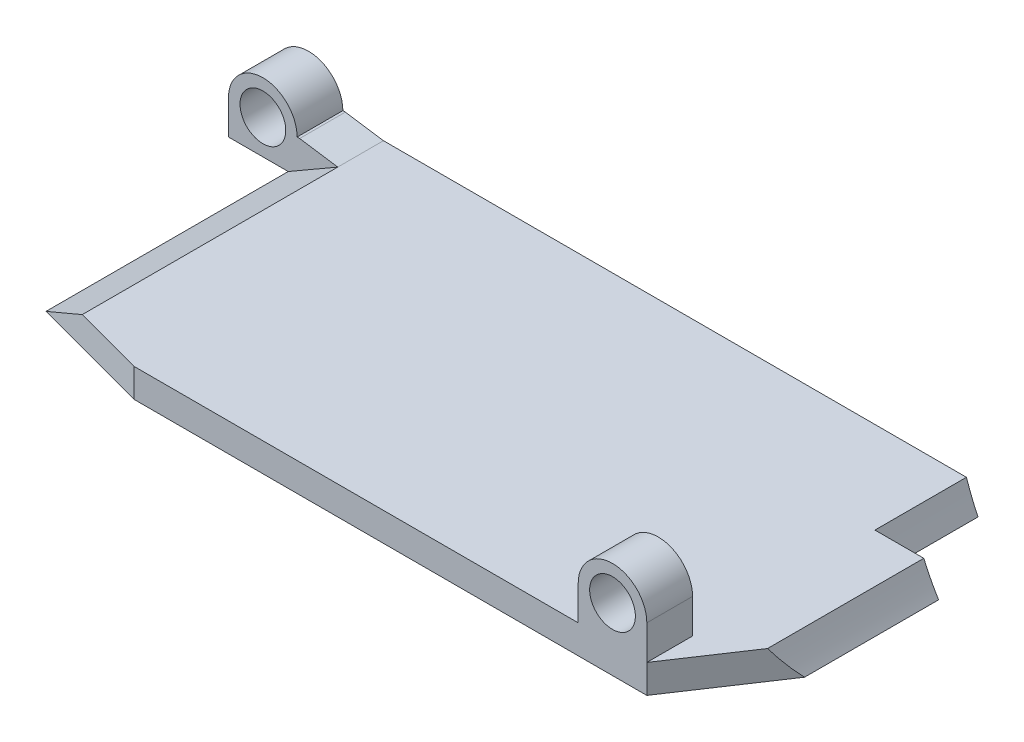
ISO-10303-21;
HEADER;
FILE_DESCRIPTION(('STEP AP214'),'2;1');
FILE_NAME('part.step','',(''),(''),'','','');
FILE_SCHEMA(('AUTOMOTIVE_DESIGN { 1 0 10303 214 1 1 1 1 }'));
ENDSEC;
DATA;
#1=APPLICATION_CONTEXT('core data for automotive mechanical design processes');
#2=APPLICATION_PROTOCOL_DEFINITION('international standard','automotive_design',2000,#1);
#3=PRODUCT_CONTEXT('',#1,'mechanical');
#4=PRODUCT('Part','Part','',(#3));
#5=PRODUCT_RELATED_PRODUCT_CATEGORY('part','',(#4));
#6=PRODUCT_DEFINITION_FORMATION('','',#4);
#7=PRODUCT_DEFINITION_CONTEXT('part definition',#1,'design');
#8=PRODUCT_DEFINITION('design','',#6,#7);
#9=PRODUCT_DEFINITION_SHAPE('','',#8);
#10=(LENGTH_UNIT() NAMED_UNIT(*) SI_UNIT(.MILLI.,.METRE.));
#11=(NAMED_UNIT(*) PLANE_ANGLE_UNIT() SI_UNIT($,.RADIAN.));
#12=(NAMED_UNIT(*) SI_UNIT($,.STERADIAN.) SOLID_ANGLE_UNIT());
#13=UNCERTAINTY_MEASURE_WITH_UNIT(LENGTH_MEASURE(1.E-05),#10,'distance_accuracy_value','');
#14=(GEOMETRIC_REPRESENTATION_CONTEXT(3) GLOBAL_UNCERTAINTY_ASSIGNED_CONTEXT((#13)) GLOBAL_UNIT_ASSIGNED_CONTEXT((#10,
#11,#12)) REPRESENTATION_CONTEXT('',''));
#15=CARTESIAN_POINT('',(0.,0.,0.));
#16=DIRECTION('',(0.,0.,1.));
#17=DIRECTION('',(1.,0.,0.));
#18=AXIS2_PLACEMENT_3D('',#15,#16,#17);
#19=CARTESIAN_POINT('',(-14.6132968385494,25.3109725904531,-16.));
#20=DIRECTION('',(0.500000000000001,-0.866025403784438,0.));
#21=DIRECTION('',(0.866025403784438,0.500000000000001,0.));
#22=AXIS2_PLACEMENT_3D('',#19,#20,#21);
#23=PLANE('',#22);
#24=DIRECTION('',(0.866025403784438,0.500000000000001,0.));
#25=VECTOR('',#24,1.);
#26=CARTESIAN_POINT('',(-14.6132968385494,25.3109725904531,-14.));
#27=LINE('',#26,#25);
#28=CARTESIAN_POINT('',(-15.5849298668677,24.75,-14.));
#29=VERTEX_POINT('',#28);
#30=CARTESIAN_POINT('',(-13.4198663574066,26.,-14.));
#31=VERTEX_POINT('',#30);
#32=EDGE_CURVE('E200',#29,#31,#27,.T.);
#33=ORIENTED_EDGE('',*,*,#32,.F.);
#34=DIRECTION('',(0.,0.,1.));
#35=VECTOR('',#34,1.);
#36=CARTESIAN_POINT('',(-15.5849298668677,24.75,-16.));
#37=LINE('',#36,#35);
#38=CARTESIAN_POINT('',(-15.5849298668677,24.75,-3.40823238021835));
#39=VERTEX_POINT('',#38);
#40=EDGE_CURVE('E274',#29,#39,#37,.T.);
#41=ORIENTED_EDGE('',*,*,#40,.T.);
#42=DIRECTION('',(0.843610022961952,0.48705847384815,0.22604462437945));
#43=VECTOR('',#42,1.);
#44=CARTESIAN_POINT('',(-17.0641119412203,23.8959938311921,-3.80457802249971));
#45=LINE('',#44,#43);
#46=CARTESIAN_POINT('',(-13.4198663574066,26.,-2.82810536129617));
#47=VERTEX_POINT('',#46);
#48=EDGE_CURVE('E230',#39,#47,#45,.T.);
#49=ORIENTED_EDGE('',*,*,#48,.T.);
#50=DIRECTION('',(0.,0.,1.));
#51=VECTOR('',#50,1.);
#52=CARTESIAN_POINT('',(-13.4198663574066,26.,-16.));
#53=LINE('',#52,#51);
#54=EDGE_CURVE('E271',#31,#47,#53,.T.);
#55=ORIENTED_EDGE('',*,*,#54,.F.);
#56=EDGE_LOOP('',(#33,#41,#49,#55));
#57=FACE_BOUND('',#56,.T.);
#58=ADVANCED_FACE('F34',(#57),#23,.F.);
#59=CARTESIAN_POINT('',(22.5,29.5,-16.));
#60=DIRECTION('',(0.,0.,1.));
#61=DIRECTION('',(1.,0.,0.));
#62=AXIS2_PLACEMENT_3D('',#59,#60,#61);
#63=CYLINDRICAL_SURFACE('',#62,9.00000000000001);
#64=CARTESIAN_POINT('',(22.5,29.5,-17.605551275464));
#65=DIRECTION('',(-0.832050294337844,0.,-0.554700196225229));
#66=DIRECTION('',(-0.554700196225229,0.,0.832050294337844));
#67=AXIS2_PLACEMENT_3D('',#64,#65,#66);
#68=ELLIPSE('',#67,16.224980739588,9.00000000000001);
#69=CARTESIAN_POINT('',(14.8555575742897,24.75,-6.1388876368985));
#70=VERTEX_POINT('',#69);
#71=CARTESIAN_POINT('',(14.2084380241115,26.,-5.16820831163123));
#72=VERTEX_POINT('',#71);
#73=EDGE_CURVE('E241',#70,#72,#68,.T.);
#74=ORIENTED_EDGE('',*,*,#73,.F.);
#75=DIRECTION('',(0.,0.,1.));
#76=VECTOR('',#75,1.);
#77=CARTESIAN_POINT('',(14.8555575742897,24.75,-16.));
#78=LINE('',#77,#76);
#79=CARTESIAN_POINT('',(14.8555575742897,24.75,-12.));
#80=VERTEX_POINT('',#79);
#81=EDGE_CURVE('E42',#80,#70,#78,.T.);
#82=ORIENTED_EDGE('',*,*,#81,.F.);
#83=CARTESIAN_POINT('',(22.5,29.5,-12.));
#84=DIRECTION('',(0.,0.,-1.));
#85=DIRECTION('',(-1.,0.,0.));
#86=AXIS2_PLACEMENT_3D('',#83,#84,#85);
#87=CIRCLE('',#86,9.00000000000001);
#88=CARTESIAN_POINT('',(14.2084380241115,26.,-12.));
#89=VERTEX_POINT('',#88);
#90=EDGE_CURVE('E255',#80,#89,#87,.T.);
#91=ORIENTED_EDGE('',*,*,#90,.T.);
#92=DIRECTION('',(0.,0.,1.));
#93=VECTOR('',#92,1.);
#94=CARTESIAN_POINT('',(14.2084380241115,26.,-16.));
#95=LINE('',#94,#93);
#96=EDGE_CURVE('E266',#89,#72,#95,.T.);
#97=ORIENTED_EDGE('',*,*,#96,.T.);
#98=EDGE_LOOP('',(#74,#82,#91,#97));
#99=FACE_BOUND('',#98,.T.);
#100=ADVANCED_FACE('F36',(#99),#63,.F.);
#101=CARTESIAN_POINT('',(0.,24.75,-16.));
#102=DIRECTION('',(0.,-1.,0.));
#103=DIRECTION('',(1.,0.,0.));
#104=AXIS2_PLACEMENT_3D('',#101,#102,#103);
#105=PLANE('',#104);
#106=DIRECTION('',(0.96592582628907,0.,0.258819045102514));
#107=VECTOR('',#106,1.);
#108=CARTESIAN_POINT('',(-10.329335075029,24.75,-2.));
#109=LINE('',#108,#107);
#110=CARTESIAN_POINT('',(-10.329335075029,24.75,-2.));
#111=VERTEX_POINT('',#110);
#112=EDGE_CURVE('E216',#39,#111,#109,.T.);
#113=ORIENTED_EDGE('',*,*,#112,.F.);
#114=ORIENTED_EDGE('',*,*,#40,.F.);
#115=DIRECTION('',(-1.,0.,0.));
#116=VECTOR('',#115,1.);
#117=CARTESIAN_POINT('',(0.,24.75,-14.));
#118=LINE('',#117,#116);
#119=CARTESIAN_POINT('',(-18.1957444455323,24.75,-14.));
#120=VERTEX_POINT('',#119);
#121=EDGE_CURVE('E184',#29,#120,#118,.T.);
#122=ORIENTED_EDGE('',*,*,#121,.T.);
#123=DIRECTION('',(0.,0.,-1.));
#124=VECTOR('',#123,1.);
#125=CARTESIAN_POINT('',(-18.1957444455323,24.75,-14.));
#126=LINE('',#125,#124);
#127=CARTESIAN_POINT('',(-18.1957444455323,24.75,-16.));
#128=VERTEX_POINT('',#127);
#129=EDGE_CURVE('E203',#120,#128,#126,.T.);
#130=ORIENTED_EDGE('',*,*,#129,.T.);
#131=DIRECTION('',(1.,0.,0.));
#132=VECTOR('',#131,1.);
#133=CARTESIAN_POINT('',(0.,24.75,-16.));
#134=LINE('',#133,#132);
#135=CARTESIAN_POINT('',(12.5784325835078,24.75,-16.));
#136=VERTEX_POINT('',#135);
#137=EDGE_CURVE('E259',#128,#136,#134,.T.);
#138=ORIENTED_EDGE('',*,*,#137,.T.);
#139=DIRECTION('',(0.,0.,-1.));
#140=VECTOR('',#139,1.);
#141=CARTESIAN_POINT('',(12.5784325835078,24.75,-12.));
#142=LINE('',#141,#140);
#143=CARTESIAN_POINT('',(12.5784325835078,24.75,-12.));
#144=VERTEX_POINT('',#143);
#145=EDGE_CURVE('E249',#144,#136,#142,.T.);
#146=ORIENTED_EDGE('',*,*,#145,.F.);
#147=DIRECTION('',(-1.,0.,0.));
#148=VECTOR('',#147,1.);
#149=CARTESIAN_POINT('',(12.5784325835078,24.75,-12.));
#150=LINE('',#149,#148);
#151=EDGE_CURVE('E247',#80,#144,#150,.T.);
#152=ORIENTED_EDGE('',*,*,#151,.F.);
#153=ORIENTED_EDGE('',*,*,#81,.T.);
#154=DIRECTION('',(0.554700196225229,0.,-0.832050294337844));
#155=VECTOR('',#154,1.);
#156=CARTESIAN_POINT('',(12.0962991496907,24.75,-2.));
#157=LINE('',#156,#155);
#158=CARTESIAN_POINT('',(12.0962991496907,24.75,-2.));
#159=VERTEX_POINT('',#158);
#160=EDGE_CURVE('E233',#159,#70,#157,.T.);
#161=ORIENTED_EDGE('',*,*,#160,.F.);
#162=DIRECTION('',(1.,0.,0.));
#163=VECTOR('',#162,1.);
#164=CARTESIAN_POINT('',(0.,24.75,-2.));
#165=LINE('',#164,#163);
#166=EDGE_CURVE('E258',#111,#159,#165,.T.);
#167=ORIENTED_EDGE('',*,*,#166,.F.);
#168=EDGE_LOOP('',(#113,#114,#122,#130,#138,#146,#152,#153,#161,#167));
#169=FACE_BOUND('',#168,.T.);
#170=ADVANCED_FACE('F281',(#169),#105,.T.);
#171=CARTESIAN_POINT('',(0.,26.,-16.));
#172=DIRECTION('',(0.,-1.,0.));
#173=DIRECTION('',(0.,0.,-1.));
#174=AXIS2_PLACEMENT_3D('',#171,#172,#173);
#175=PLANE('',#174);
#176=DIRECTION('',(-1.,0.,0.));
#177=VECTOR('',#176,1.);
#178=CARTESIAN_POINT('',(0.,26.,-4.));
#179=LINE('',#178,#177);
#180=CARTESIAN_POINT('',(12.0962991496907,26.,-4.));
#181=VERTEX_POINT('',#180);
#182=CARTESIAN_POINT('',(9.09629914969067,26.,-4.));
#183=VERTEX_POINT('',#182);
#184=EDGE_CURVE('E53',#181,#183,#179,.T.);
#185=ORIENTED_EDGE('',*,*,#184,.F.);
#186=DIRECTION('',(0.,0.,1.));
#187=VECTOR('',#186,1.);
#188=CARTESIAN_POINT('',(12.0962991496907,26.,-4.));
#189=LINE('',#188,#187);
#190=CARTESIAN_POINT('',(12.0962991496907,26.,-2.));
#191=VERTEX_POINT('',#190);
#192=EDGE_CURVE('E166',#181,#191,#189,.T.);
#193=ORIENTED_EDGE('',*,*,#192,.T.);
#194=DIRECTION('',(0.554700196225229,0.,-0.832050294337844));
#195=VECTOR('',#194,1.);
#196=CARTESIAN_POINT('',(12.0962991496907,26.,-2.));
#197=LINE('',#196,#195);
#198=EDGE_CURVE('E234',#191,#72,#197,.T.);
#199=ORIENTED_EDGE('',*,*,#198,.T.);
#200=ORIENTED_EDGE('',*,*,#96,.F.);
#201=DIRECTION('',(1.,0.,0.));
#202=VECTOR('',#201,1.);
#203=CARTESIAN_POINT('',(0.,26.,-12.));
#204=LINE('',#203,#202);
#205=CARTESIAN_POINT('',(12.0716731926929,26.,-12.));
#206=VERTEX_POINT('',#205);
#207=EDGE_CURVE('E11',#206,#89,#204,.T.);
#208=ORIENTED_EDGE('',*,*,#207,.F.);
#209=DIRECTION('',(0.,0.,-1.));
#210=VECTOR('',#209,1.);
#211=CARTESIAN_POINT('',(12.0716731926929,26.,-12.));
#212=LINE('',#211,#210);
#213=CARTESIAN_POINT('',(12.0716731926929,26.,-16.));
#214=VERTEX_POINT('',#213);
#215=EDGE_CURVE('E252',#206,#214,#212,.T.);
#216=ORIENTED_EDGE('',*,*,#215,.T.);
#217=DIRECTION('',(1.,0.,0.));
#218=VECTOR('',#217,1.);
#219=CARTESIAN_POINT('',(0.,26.,-16.));
#220=LINE('',#219,#218);
#221=CARTESIAN_POINT('',(-13.4198663574066,26.,-16.));
#222=VERTEX_POINT('',#221);
#223=EDGE_CURVE('E262',#222,#214,#220,.T.);
#224=ORIENTED_EDGE('',*,*,#223,.F.);
#225=EDGE_CURVE('E272',#222,#31,#53,.T.);
#226=ORIENTED_EDGE('',*,*,#225,.T.);
#227=ORIENTED_EDGE('',*,*,#54,.T.);
#228=DIRECTION('',(0.96592582628907,0.,0.258819045102514));
#229=VECTOR('',#228,1.);
#230=CARTESIAN_POINT('',(-10.329335075029,26.,-2.));
#231=LINE('',#230,#229);
#232=CARTESIAN_POINT('',(-10.329335075029,26.,-2.));
#233=VERTEX_POINT('',#232);
#234=EDGE_CURVE('E223',#47,#233,#231,.T.);
#235=ORIENTED_EDGE('',*,*,#234,.T.);
#236=DIRECTION('',(1.,0.,0.));
#237=VECTOR('',#236,1.);
#238=CARTESIAN_POINT('',(0.,26.,-2.));
#239=LINE('',#238,#237);
#240=CARTESIAN_POINT('',(9.09629914969067,26.,-2.));
#241=VERTEX_POINT('',#240);
#242=EDGE_CURVE('E263',#233,#241,#239,.T.);
#243=ORIENTED_EDGE('',*,*,#242,.T.);
#244=DIRECTION('',(0.,0.,1.));
#245=VECTOR('',#244,1.);
#246=CARTESIAN_POINT('',(9.09629914969067,26.,-4.));
#247=LINE('',#246,#245);
#248=EDGE_CURVE('E49',#183,#241,#247,.T.);
#249=ORIENTED_EDGE('',*,*,#248,.F.);
#250=EDGE_LOOP('',(#185,#193,#199,#200,#208,#216,#224,#226,#227,#235,#243,#249));
#251=FACE_BOUND('',#250,.T.);
#252=ADVANCED_FACE('F290',(#251),#175,.F.);
#253=CARTESIAN_POINT('',(0.,0.,-16.));
#254=DIRECTION('',(0.,0.,-1.));
#255=DIRECTION('',(-1.,0.,0.));
#256=AXIS2_PLACEMENT_3D('',#253,#254,#255);
#257=PLANE('',#256);
#258=CARTESIAN_POINT('',(-16.6917910527879,26.25,-16.));
#259=DIRECTION('',(0.,0.,-1.));
#260=DIRECTION('',(-1.,0.,0.));
#261=AXIS2_PLACEMENT_3D('',#258,#259,#260);
#262=CIRCLE('',#261,1.);
#263=CARTESIAN_POINT('',(-17.6917910527879,26.25,-16.));
#264=VERTEX_POINT('',#263);
#265=EDGE_CURVE('E360',#264,#264,#262,.T.);
#266=ORIENTED_EDGE('',*,*,#265,.F.);
#267=EDGE_LOOP('',(#266));
#268=FACE_BOUND('',#267,.T.);
#269=CARTESIAN_POINT('',(22.5,29.5,-16.));
#270=DIRECTION('',(0.,0.,-1.));
#271=DIRECTION('',(-1.,0.,0.));
#272=AXIS2_PLACEMENT_3D('',#269,#270,#271);
#273=CIRCLE('',#272,11.);
#274=EDGE_CURVE('E243',#136,#214,#273,.T.);
#275=ORIENTED_EDGE('',*,*,#274,.F.);
#276=ORIENTED_EDGE('',*,*,#137,.F.);
#277=DIRECTION('',(0.,1.,0.));
#278=VECTOR('',#277,1.);
#279=CARTESIAN_POINT('',(-18.1957444455323,0.,-16.));
#280=LINE('',#279,#278);
#281=CARTESIAN_POINT('',(-18.1957444455323,26.25,-16.));
#282=VERTEX_POINT('',#281);
#283=EDGE_CURVE('E181',#128,#282,#280,.T.);
#284=ORIENTED_EDGE('',*,*,#283,.T.);
#285=CARTESIAN_POINT('',(-16.6957444455323,26.25,-16.));
#286=DIRECTION('',(0.,0.,-1.));
#287=DIRECTION('',(-1.,0.,0.));
#288=AXIS2_PLACEMENT_3D('',#285,#286,#287);
#289=CIRCLE('',#288,1.5);
#290=CARTESIAN_POINT('',(-15.1957444455323,26.25,-16.));
#291=VERTEX_POINT('',#290);
#292=EDGE_CURVE('E206',#282,#291,#289,.T.);
#293=ORIENTED_EDGE('',*,*,#292,.T.);
#294=DIRECTION('',(1.,0.,0.));
#295=VECTOR('',#294,1.);
#296=CARTESIAN_POINT('',(0.,26.25,-16.));
#297=LINE('',#296,#295);
#298=CARTESIAN_POINT('',(-15.0857444455323,26.25,-16.));
#299=VERTEX_POINT('',#298);
#300=EDGE_CURVE('E209',#291,#299,#297,.T.);
#301=ORIENTED_EDGE('',*,*,#300,.T.);
#302=DIRECTION('',(0.988926049356473,-0.148409126755062,0.));
#303=VECTOR('',#302,1.);
#304=CARTESIAN_POINT('',(3.5203307714882,23.4577675807065,-16.));
#305=LINE('',#304,#303);
#306=EDGE_CURVE('E188',#299,#222,#305,.T.);
#307=ORIENTED_EDGE('',*,*,#306,.T.);
#308=ORIENTED_EDGE('',*,*,#223,.T.);
#309=EDGE_LOOP('',(#275,#276,#284,#293,#301,#307,#308));
#310=FACE_BOUND('',#309,.T.);
#311=ADVANCED_FACE('F324',(#268,#310),#257,.T.);
#312=CARTESIAN_POINT('',(0.,0.,-2.));
#313=DIRECTION('',(0.,0.,-1.));
#314=DIRECTION('',(-1.,0.,0.));
#315=AXIS2_PLACEMENT_3D('',#312,#313,#314);
#316=PLANE('',#315);
#317=CARTESIAN_POINT('',(10.5962991496907,27.5,-2.));
#318=DIRECTION('',(0.,0.,1.));
#319=DIRECTION('',(1.,0.,0.));
#320=AXIS2_PLACEMENT_3D('',#317,#318,#319);
#321=CIRCLE('',#320,0.999999999999987);
#322=CARTESIAN_POINT('',(11.5962991496907,27.5,-2.));
#323=VERTEX_POINT('',#322);
#324=EDGE_CURVE('E365',#323,#323,#321,.T.);
#325=ORIENTED_EDGE('',*,*,#324,.F.);
#326=EDGE_LOOP('',(#325));
#327=FACE_BOUND('',#326,.T.);
#328=ORIENTED_EDGE('',*,*,#242,.F.);
#329=DIRECTION('',(0.,-1.,0.));
#330=VECTOR('',#329,1.);
#331=CARTESIAN_POINT('',(-10.329335075029,26.,-2.));
#332=LINE('',#331,#330);
#333=EDGE_CURVE('E226',#233,#111,#332,.T.);
#334=ORIENTED_EDGE('',*,*,#333,.T.);
#335=ORIENTED_EDGE('',*,*,#166,.T.);
#336=DIRECTION('',(0.,-1.,0.));
#337=VECTOR('',#336,1.);
#338=CARTESIAN_POINT('',(12.0962991496907,26.,-2.));
#339=LINE('',#338,#337);
#340=EDGE_CURVE('E237',#191,#159,#339,.T.);
#341=ORIENTED_EDGE('',*,*,#340,.F.);
#342=DIRECTION('',(0.,1.,0.));
#343=VECTOR('',#342,1.);
#344=CARTESIAN_POINT('',(12.0962991496907,0.,-2.));
#345=LINE('',#344,#343);
#346=CARTESIAN_POINT('',(12.0962991496907,27.5,-2.));
#347=VERTEX_POINT('',#346);
#348=EDGE_CURVE('E177',#191,#347,#345,.T.);
#349=ORIENTED_EDGE('',*,*,#348,.T.);
#350=CARTESIAN_POINT('',(10.5962991496907,27.5,-2.));
#351=DIRECTION('',(0.,0.,1.));
#352=DIRECTION('',(1.,0.,0.));
#353=AXIS2_PLACEMENT_3D('',#350,#351,#352);
#354=CIRCLE('',#353,1.5);
#355=CARTESIAN_POINT('',(9.09629914969068,27.5,-2.));
#356=VERTEX_POINT('',#355);
#357=EDGE_CURVE('E150',#347,#356,#354,.T.);
#358=ORIENTED_EDGE('',*,*,#357,.T.);
#359=DIRECTION('',(0.,-1.,0.));
#360=VECTOR('',#359,1.);
#361=CARTESIAN_POINT('',(9.09629914969062,0.,-2.));
#362=LINE('',#361,#360);
#363=EDGE_CURVE('E167',#356,#241,#362,.T.);
#364=ORIENTED_EDGE('',*,*,#363,.T.);
#365=EDGE_LOOP('',(#328,#334,#335,#341,#349,#358,#364));
#366=FACE_BOUND('',#365,.T.);
#367=ADVANCED_FACE('F294',(#327,#366),#316,.F.);
#368=CARTESIAN_POINT('',(22.5,29.5,-12.));
#369=DIRECTION('',(0.,0.,-1.));
#370=DIRECTION('',(-1.,0.,0.));
#371=AXIS2_PLACEMENT_3D('',#368,#369,#370);
#372=CYLINDRICAL_SURFACE('',#371,11.);
#373=CARTESIAN_POINT('',(22.5,29.5,-12.));
#374=DIRECTION('',(0.,0.,-1.));
#375=DIRECTION('',(-1.,0.,0.));
#376=AXIS2_PLACEMENT_3D('',#373,#374,#375);
#377=CIRCLE('',#376,11.);
#378=EDGE_CURVE('E244',#144,#206,#377,.T.);
#379=ORIENTED_EDGE('',*,*,#378,.F.);
#380=ORIENTED_EDGE('',*,*,#145,.T.);
#381=ORIENTED_EDGE('',*,*,#274,.T.);
#382=ORIENTED_EDGE('',*,*,#215,.F.);
#383=EDGE_LOOP('',(#379,#380,#381,#382));
#384=FACE_BOUND('',#383,.T.);
#385=ADVANCED_FACE('F327',(#384),#372,.F.);
#386=CARTESIAN_POINT('',(22.5,29.5,-12.));
#387=DIRECTION('',(0.,0.,-1.));
#388=DIRECTION('',(-1.,0.,0.));
#389=AXIS2_PLACEMENT_3D('',#386,#387,#388);
#390=PLANE('',#389);
#391=ORIENTED_EDGE('',*,*,#151,.T.);
#392=ORIENTED_EDGE('',*,*,#378,.T.);
#393=ORIENTED_EDGE('',*,*,#207,.T.);
#394=ORIENTED_EDGE('',*,*,#90,.F.);
#395=EDGE_LOOP('',(#391,#392,#393,#394));
#396=FACE_BOUND('',#395,.T.);
#397=ADVANCED_FACE('F329',(#396),#390,.T.);
#398=CARTESIAN_POINT('',(12.0962991496907,26.,-2.));
#399=DIRECTION('',(-0.832050294337844,0.,-0.554700196225229));
#400=DIRECTION('',(-0.554700196225229,0.,0.832050294337844));
#401=AXIS2_PLACEMENT_3D('',#398,#399,#400);
#402=PLANE('',#401);
#403=ORIENTED_EDGE('',*,*,#73,.T.);
#404=ORIENTED_EDGE('',*,*,#198,.F.);
#405=ORIENTED_EDGE('',*,*,#340,.T.);
#406=ORIENTED_EDGE('',*,*,#160,.T.);
#407=EDGE_LOOP('',(#403,#404,#405,#406));
#408=FACE_BOUND('',#407,.T.);
#409=ADVANCED_FACE('F289',(#408),#402,.F.);
#410=CARTESIAN_POINT('',(-10.329335075029,26.,-2.));
#411=DIRECTION('',(0.258819045102514,0.,-0.96592582628907));
#412=DIRECTION('',(-0.96592582628907,0.,-0.258819045102514));
#413=AXIS2_PLACEMENT_3D('',#410,#411,#412);
#414=PLANE('',#413);
#415=ORIENTED_EDGE('',*,*,#112,.T.);
#416=ORIENTED_EDGE('',*,*,#333,.F.);
#417=ORIENTED_EDGE('',*,*,#234,.F.);
#418=ORIENTED_EDGE('',*,*,#48,.F.);
#419=EDGE_LOOP('',(#415,#416,#417,#418));
#420=FACE_BOUND('',#419,.T.);
#421=ADVANCED_FACE('F299',(#420),#414,.F.);
#422=CARTESIAN_POINT('',(3.5203307714882,23.4577675807065,-14.));
#423=DIRECTION('',(0.148409126755062,0.988926049356472,0.));
#424=DIRECTION('',(-0.988926049356472,0.148409126755062,0.));
#425=AXIS2_PLACEMENT_3D('',#422,#423,#424);
#426=PLANE('',#425);
#427=ORIENTED_EDGE('',*,*,#306,.F.);
#428=DIRECTION('',(0.,0.,-1.));
#429=VECTOR('',#428,1.);
#430=CARTESIAN_POINT('',(-15.0857444455323,26.25,-14.));
#431=LINE('',#430,#429);
#432=CARTESIAN_POINT('',(-15.0857444455323,26.25,-14.));
#433=VERTEX_POINT('',#432);
#434=EDGE_CURVE('E214',#433,#299,#431,.T.);
#435=ORIENTED_EDGE('',*,*,#434,.F.);
#436=DIRECTION('',(0.988926049356473,-0.148409126755062,0.));
#437=VECTOR('',#436,1.);
#438=CARTESIAN_POINT('',(3.5203307714882,23.4577675807065,-14.));
#439=LINE('',#438,#437);
#440=EDGE_CURVE('E197',#433,#31,#439,.T.);
#441=ORIENTED_EDGE('',*,*,#440,.T.);
#442=ORIENTED_EDGE('',*,*,#225,.F.);
#443=EDGE_LOOP('',(#427,#435,#441,#442));
#444=FACE_BOUND('',#443,.T.);
#445=ADVANCED_FACE('F311',(#444),#426,.T.);
#446=CARTESIAN_POINT('',(0.,26.25,-14.));
#447=DIRECTION('',(0.,1.,0.));
#448=DIRECTION('',(0.,0.,1.));
#449=AXIS2_PLACEMENT_3D('',#446,#447,#448);
#450=PLANE('',#449);
#451=ORIENTED_EDGE('',*,*,#300,.F.);
#452=DIRECTION('',(0.,0.,-1.));
#453=VECTOR('',#452,1.);
#454=CARTESIAN_POINT('',(-15.1957444455323,26.25,-14.));
#455=LINE('',#454,#453);
#456=CARTESIAN_POINT('',(-15.1957444455323,26.25,-14.));
#457=VERTEX_POINT('',#456);
#458=EDGE_CURVE('E217',#457,#291,#455,.T.);
#459=ORIENTED_EDGE('',*,*,#458,.F.);
#460=DIRECTION('',(1.,0.,0.));
#461=VECTOR('',#460,1.);
#462=CARTESIAN_POINT('',(0.,26.25,-14.));
#463=LINE('',#462,#461);
#464=EDGE_CURVE('E194',#457,#433,#463,.T.);
#465=ORIENTED_EDGE('',*,*,#464,.T.);
#466=ORIENTED_EDGE('',*,*,#434,.T.);
#467=EDGE_LOOP('',(#451,#459,#465,#466));
#468=FACE_BOUND('',#467,.T.);
#469=ADVANCED_FACE('F314',(#468),#450,.T.);
#470=CARTESIAN_POINT('',(-16.6957444455323,26.25,-14.));
#471=DIRECTION('',(0.,0.,-1.));
#472=DIRECTION('',(-1.,0.,0.));
#473=AXIS2_PLACEMENT_3D('',#470,#471,#472);
#474=CYLINDRICAL_SURFACE('',#473,1.5);
#475=ORIENTED_EDGE('',*,*,#292,.F.);
#476=DIRECTION('',(0.,0.,-1.));
#477=VECTOR('',#476,1.);
#478=CARTESIAN_POINT('',(-18.1957444455323,26.25,-14.));
#479=LINE('',#478,#477);
#480=CARTESIAN_POINT('',(-18.1957444455323,26.25,-14.));
#481=VERTEX_POINT('',#480);
#482=EDGE_CURVE('E219',#481,#282,#479,.T.);
#483=ORIENTED_EDGE('',*,*,#482,.F.);
#484=CARTESIAN_POINT('',(-16.6957444455323,26.25,-14.));
#485=DIRECTION('',(0.,0.,-1.));
#486=DIRECTION('',(-1.,0.,0.));
#487=AXIS2_PLACEMENT_3D('',#484,#485,#486);
#488=CIRCLE('',#487,1.5);
#489=EDGE_CURVE('E191',#481,#457,#488,.T.);
#490=ORIENTED_EDGE('',*,*,#489,.T.);
#491=ORIENTED_EDGE('',*,*,#458,.T.);
#492=EDGE_LOOP('',(#475,#483,#490,#491));
#493=FACE_BOUND('',#492,.T.);
#494=ADVANCED_FACE('F318',(#493),#474,.T.);
#495=CARTESIAN_POINT('',(-18.1957444455323,0.,-14.));
#496=DIRECTION('',(-1.,0.,0.));
#497=DIRECTION('',(0.,0.,1.));
#498=AXIS2_PLACEMENT_3D('',#495,#496,#497);
#499=PLANE('',#498);
#500=ORIENTED_EDGE('',*,*,#283,.F.);
#501=ORIENTED_EDGE('',*,*,#129,.F.);
#502=DIRECTION('',(0.,1.,0.));
#503=VECTOR('',#502,1.);
#504=CARTESIAN_POINT('',(-18.1957444455323,0.,-14.));
#505=LINE('',#504,#503);
#506=EDGE_CURVE('E187',#120,#481,#505,.T.);
#507=ORIENTED_EDGE('',*,*,#506,.T.);
#508=ORIENTED_EDGE('',*,*,#482,.T.);
#509=EDGE_LOOP('',(#500,#501,#507,#508));
#510=FACE_BOUND('',#509,.T.);
#511=ADVANCED_FACE('F321',(#510),#499,.T.);
#512=CARTESIAN_POINT('',(0.,0.,-14.));
#513=DIRECTION('',(0.,0.,-1.));
#514=DIRECTION('',(-1.,0.,0.));
#515=AXIS2_PLACEMENT_3D('',#512,#513,#514);
#516=PLANE('',#515);
#517=CARTESIAN_POINT('',(-16.6917910527879,26.25,-14.));
#518=DIRECTION('',(0.,0.,-1.));
#519=DIRECTION('',(-1.,0.,0.));
#520=AXIS2_PLACEMENT_3D('',#517,#518,#519);
#521=CIRCLE('',#520,0.999999999999999);
#522=CARTESIAN_POINT('',(-17.6917910527879,26.25,-14.));
#523=VERTEX_POINT('',#522);
#524=EDGE_CURVE('E172',#523,#523,#521,.T.);
#525=ORIENTED_EDGE('',*,*,#524,.T.);
#526=EDGE_LOOP('',(#525));
#527=FACE_BOUND('',#526,.T.);
#528=ORIENTED_EDGE('',*,*,#121,.F.);
#529=ORIENTED_EDGE('',*,*,#32,.T.);
#530=ORIENTED_EDGE('',*,*,#440,.F.);
#531=ORIENTED_EDGE('',*,*,#464,.F.);
#532=ORIENTED_EDGE('',*,*,#489,.F.);
#533=ORIENTED_EDGE('',*,*,#506,.F.);
#534=EDGE_LOOP('',(#528,#529,#530,#531,#532,#533));
#535=FACE_BOUND('',#534,.T.);
#536=ADVANCED_FACE('F305',(#527,#535),#516,.F.);
#537=CARTESIAN_POINT('',(12.0962991496907,0.,-4.));
#538=DIRECTION('',(1.,0.,0.));
#539=DIRECTION('',(0.,0.,-1.));
#540=AXIS2_PLACEMENT_3D('',#537,#538,#539);
#541=PLANE('',#540);
#542=ORIENTED_EDGE('',*,*,#348,.F.);
#543=ORIENTED_EDGE('',*,*,#192,.F.);
#544=DIRECTION('',(0.,1.,0.));
#545=VECTOR('',#544,1.);
#546=CARTESIAN_POINT('',(12.0962991496907,0.,-4.));
#547=LINE('',#546,#545);
#548=CARTESIAN_POINT('',(12.0962991496907,27.5,-4.));
#549=VERTEX_POINT('',#548);
#550=EDGE_CURVE('E161',#181,#549,#547,.T.);
#551=ORIENTED_EDGE('',*,*,#550,.T.);
#552=DIRECTION('',(0.,0.,1.));
#553=VECTOR('',#552,1.);
#554=CARTESIAN_POINT('',(12.0962991496907,27.5,-4.));
#555=LINE('',#554,#553);
#556=EDGE_CURVE('E145',#549,#347,#555,.T.);
#557=ORIENTED_EDGE('',*,*,#556,.T.);
#558=EDGE_LOOP('',(#542,#543,#551,#557));
#559=FACE_BOUND('',#558,.T.);
#560=ADVANCED_FACE('F165',(#559),#541,.T.);
#561=CARTESIAN_POINT('',(9.09629914969062,0.,-4.));
#562=DIRECTION('',(-1.,0.,0.));
#563=DIRECTION('',(0.,-1.,0.));
#564=AXIS2_PLACEMENT_3D('',#561,#562,#563);
#565=PLANE('',#564);
#566=ORIENTED_EDGE('',*,*,#363,.F.);
#567=DIRECTION('',(0.,0.,1.));
#568=VECTOR('',#567,1.);
#569=CARTESIAN_POINT('',(9.09629914969068,27.5,-4.));
#570=LINE('',#569,#568);
#571=CARTESIAN_POINT('',(9.09629914969068,27.5,-4.));
#572=VERTEX_POINT('',#571);
#573=EDGE_CURVE('E155',#572,#356,#570,.T.);
#574=ORIENTED_EDGE('',*,*,#573,.F.);
#575=DIRECTION('',(0.,-1.,0.));
#576=VECTOR('',#575,1.);
#577=CARTESIAN_POINT('',(9.09629914969062,0.,-4.));
#578=LINE('',#577,#576);
#579=EDGE_CURVE('E163',#572,#183,#578,.T.);
#580=ORIENTED_EDGE('',*,*,#579,.T.);
#581=ORIENTED_EDGE('',*,*,#248,.T.);
#582=EDGE_LOOP('',(#566,#574,#580,#581));
#583=FACE_BOUND('',#582,.T.);
#584=ADVANCED_FACE('F385',(#583),#565,.T.);
#585=CARTESIAN_POINT('',(10.5962991496907,27.5,-4.));
#586=DIRECTION('',(0.,0.,1.));
#587=DIRECTION('',(1.,0.,0.));
#588=AXIS2_PLACEMENT_3D('',#585,#586,#587);
#589=CYLINDRICAL_SURFACE('',#588,1.5);
#590=ORIENTED_EDGE('',*,*,#357,.F.);
#591=ORIENTED_EDGE('',*,*,#556,.F.);
#592=CARTESIAN_POINT('',(10.5962991496907,27.5,-4.));
#593=DIRECTION('',(0.,0.,1.));
#594=DIRECTION('',(1.,0.,0.));
#595=AXIS2_PLACEMENT_3D('',#592,#593,#594);
#596=CIRCLE('',#595,1.5);
#597=EDGE_CURVE('E148',#549,#572,#596,.T.);
#598=ORIENTED_EDGE('',*,*,#597,.T.);
#599=ORIENTED_EDGE('',*,*,#573,.T.);
#600=EDGE_LOOP('',(#590,#591,#598,#599));
#601=FACE_BOUND('',#600,.T.);
#602=ADVANCED_FACE('F147',(#601),#589,.T.);
#603=CARTESIAN_POINT('',(0.,0.,-4.));
#604=DIRECTION('',(0.,0.,1.));
#605=DIRECTION('',(1.,0.,0.));
#606=AXIS2_PLACEMENT_3D('',#603,#604,#605);
#607=PLANE('',#606);
#608=CARTESIAN_POINT('',(10.5962991496907,27.5,-4.));
#609=DIRECTION('',(0.,0.,1.));
#610=DIRECTION('',(1.,0.,0.));
#611=AXIS2_PLACEMENT_3D('',#608,#609,#610);
#612=CIRCLE('',#611,0.999999999999993);
#613=CARTESIAN_POINT('',(11.5962991496907,27.5,-4.));
#614=VERTEX_POINT('',#613);
#615=EDGE_CURVE('E362',#614,#614,#612,.T.);
#616=ORIENTED_EDGE('',*,*,#615,.T.);
#617=EDGE_LOOP('',(#616));
#618=FACE_BOUND('',#617,.T.);
#619=ORIENTED_EDGE('',*,*,#550,.F.);
#620=ORIENTED_EDGE('',*,*,#184,.T.);
#621=ORIENTED_EDGE('',*,*,#579,.F.);
#622=ORIENTED_EDGE('',*,*,#597,.F.);
#623=EDGE_LOOP('',(#619,#620,#621,#622));
#624=FACE_BOUND('',#623,.T.);
#625=ADVANCED_FACE('F160',(#618,#624),#607,.F.);
#626=CARTESIAN_POINT('',(-16.6917910527879,26.25,-16.));
#627=DIRECTION('',(0.,0.,-1.));
#628=DIRECTION('',(-1.,0.,0.));
#629=AXIS2_PLACEMENT_3D('',#626,#627,#628);
#630=CYLINDRICAL_SURFACE('',#629,0.999999999999999);
#631=ORIENTED_EDGE('',*,*,#265,.T.);
#632=EDGE_LOOP('',(#631));
#633=FACE_BOUND('',#632,.T.);
#634=ORIENTED_EDGE('',*,*,#524,.F.);
#635=EDGE_LOOP('',(#634));
#636=FACE_BOUND('',#635,.T.);
#637=ADVANCED_FACE('F374',(#633,#636),#630,.F.);
#638=CARTESIAN_POINT('',(10.5962991496907,27.5,-2.));
#639=DIRECTION('',(0.,0.,1.));
#640=DIRECTION('',(1.,0.,0.));
#641=AXIS2_PLACEMENT_3D('',#638,#639,#640);
#642=CYLINDRICAL_SURFACE('',#641,0.999999999999993);
#643=ORIENTED_EDGE('',*,*,#324,.T.);
#644=EDGE_LOOP('',(#643));
#645=FACE_BOUND('',#644,.T.);
#646=ORIENTED_EDGE('',*,*,#615,.F.);
#647=EDGE_LOOP('',(#646));
#648=FACE_BOUND('',#647,.T.);
#649=ADVANCED_FACE('F371',(#645,#648),#642,.F.);
#650=CLOSED_SHELL('',(#58,#100,#170,#252,#311,#367,#385,#397,#409,#421,#445,#469,#494,#511,#536,
#560,#584,#602,#625,#637,#649));
#651=MANIFOLD_SOLID_BREP('B2',#650);
#652=ADVANCED_BREP_SHAPE_REPRESENTATION('',(#18,#651),#14);
#653=SHAPE_DEFINITION_REPRESENTATION(#9,#652);
ENDSEC;
END-ISO-10303-21;
